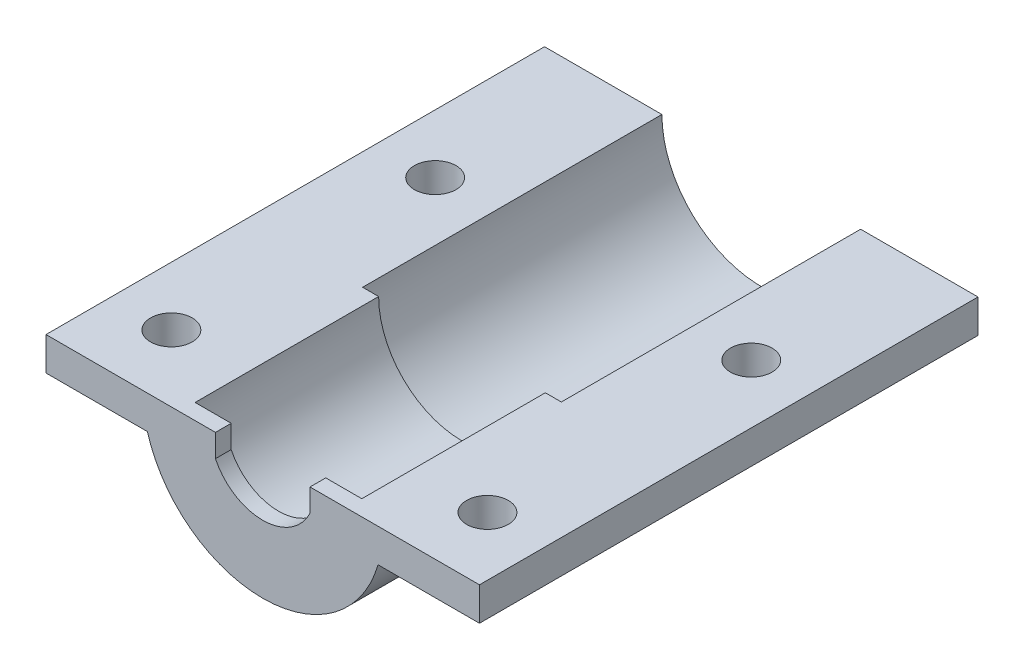
ISO-10303-21;
HEADER;
FILE_DESCRIPTION(('STEP AP214'),'2;1');
FILE_NAME('part.step','',(''),(''),'','','');
FILE_SCHEMA(('AUTOMOTIVE_DESIGN { 1 0 10303 214 1 1 1 1 }'));
ENDSEC;
DATA;
#1=APPLICATION_CONTEXT('core data for automotive mechanical design processes');
#2=APPLICATION_PROTOCOL_DEFINITION('international standard','automotive_design',2000,#1);
#3=PRODUCT_CONTEXT('',#1,'mechanical');
#4=PRODUCT('Part','Part','',(#3));
#5=PRODUCT_RELATED_PRODUCT_CATEGORY('part','',(#4));
#6=PRODUCT_DEFINITION_FORMATION('','',#4);
#7=PRODUCT_DEFINITION_CONTEXT('part definition',#1,'design');
#8=PRODUCT_DEFINITION('design','',#6,#7);
#9=PRODUCT_DEFINITION_SHAPE('','',#8);
#10=(LENGTH_UNIT() NAMED_UNIT(*) SI_UNIT(.MILLI.,.METRE.));
#11=(NAMED_UNIT(*) PLANE_ANGLE_UNIT() SI_UNIT($,.RADIAN.));
#12=(NAMED_UNIT(*) SI_UNIT($,.STERADIAN.) SOLID_ANGLE_UNIT());
#13=UNCERTAINTY_MEASURE_WITH_UNIT(LENGTH_MEASURE(1.E-05),#10,'distance_accuracy_value','');
#14=(GEOMETRIC_REPRESENTATION_CONTEXT(3) GLOBAL_UNCERTAINTY_ASSIGNED_CONTEXT((#13)) GLOBAL_UNIT_ASSIGNED_CONTEXT((#10,
#11,#12)) REPRESENTATION_CONTEXT('',''));
#15=CARTESIAN_POINT('',(0.,0.,0.));
#16=DIRECTION('',(0.,0.,1.));
#17=DIRECTION('',(1.,0.,0.));
#18=AXIS2_PLACEMENT_3D('',#15,#16,#17);
#19=CARTESIAN_POINT('',(0.,22.86,94.9452));
#20=DIRECTION('',(0.,0.,-1.));
#21=DIRECTION('',(-1.,0.,0.));
#22=AXIS2_PLACEMENT_3D('',#19,#20,#21);
#23=CYLINDRICAL_SURFACE('',#22,15.875);
#24=CARTESIAN_POINT('',(0.,22.86,91.948));
#25=DIRECTION('',(0.,0.,1.));
#26=DIRECTION('',(1.,0.,0.));
#27=AXIS2_PLACEMENT_3D('',#24,#25,#26);
#28=CIRCLE('',#27,15.875);
#29=CARTESIAN_POINT('',(-15.875,22.86,91.948));
#30=VERTEX_POINT('',#29);
#31=CARTESIAN_POINT('',(15.875,22.86,91.948));
#32=VERTEX_POINT('',#31);
#33=EDGE_CURVE('E258',#30,#32,#28,.T.);
#34=ORIENTED_EDGE('',*,*,#33,.T.);
#35=DIRECTION('',(0.,0.,-1.));
#36=VECTOR('',#35,1.);
#37=CARTESIAN_POINT('',(15.875,22.86,94.9452));
#38=LINE('',#37,#36);
#39=CARTESIAN_POINT('',(15.875,22.86,56.9976));
#40=VERTEX_POINT('',#39);
#41=EDGE_CURVE('E159',#32,#40,#38,.T.);
#42=ORIENTED_EDGE('',*,*,#41,.T.);
#43=CARTESIAN_POINT('',(0.,22.86,56.9976));
#44=DIRECTION('',(0.,0.,-1.));
#45=DIRECTION('',(-1.,0.,0.));
#46=AXIS2_PLACEMENT_3D('',#43,#44,#45);
#47=CIRCLE('',#46,15.875);
#48=CARTESIAN_POINT('',(-15.875,22.86,56.9976));
#49=VERTEX_POINT('',#48);
#50=EDGE_CURVE('E290',#49,#40,#47,.F.);
#51=ORIENTED_EDGE('',*,*,#50,.F.);
#52=DIRECTION('',(0.,0.,-1.));
#53=VECTOR('',#52,1.);
#54=CARTESIAN_POINT('',(-15.875,22.86,94.9452));
#55=LINE('',#54,#53);
#56=EDGE_CURVE('E130',#30,#49,#55,.T.);
#57=ORIENTED_EDGE('',*,*,#56,.F.);
#58=EDGE_LOOP('',(#34,#42,#51,#57));
#59=FACE_BOUND('',#58,.T.);
#60=ADVANCED_FACE('F36',(#59),#23,.F.);
#61=CARTESIAN_POINT('',(0.,22.86,94.9452));
#62=DIRECTION('',(0.,0.,-1.));
#63=DIRECTION('',(-1.,0.,0.));
#64=AXIS2_PLACEMENT_3D('',#61,#62,#63);
#65=CYLINDRICAL_SURFACE('',#64,22.86);
#66=CARTESIAN_POINT('',(0.,22.86,0.));
#67=DIRECTION('',(0.,0.,1.));
#68=DIRECTION('',(1.,0.,0.));
#69=AXIS2_PLACEMENT_3D('',#66,#67,#68);
#70=CIRCLE('',#69,22.86);
#71=CARTESIAN_POINT('',(-21.960352911554,16.51,0.));
#72=VERTEX_POINT('',#71);
#73=CARTESIAN_POINT('',(21.960352911554,16.51,0.));
#74=VERTEX_POINT('',#73);
#75=EDGE_CURVE('E139',#72,#74,#70,.T.);
#76=ORIENTED_EDGE('',*,*,#75,.T.);
#77=DIRECTION('',(0.,0.,-1.));
#78=VECTOR('',#77,1.);
#79=CARTESIAN_POINT('',(21.960352911554,16.51,94.9452));
#80=LINE('',#79,#78);
#81=CARTESIAN_POINT('',(21.960352911554,16.51,94.9452));
#82=VERTEX_POINT('',#81);
#83=EDGE_CURVE('E168',#82,#74,#80,.T.);
#84=ORIENTED_EDGE('',*,*,#83,.F.);
#85=CARTESIAN_POINT('',(0.,22.86,94.9452));
#86=DIRECTION('',(0.,0.,1.));
#87=DIRECTION('',(1.,0.,0.));
#88=AXIS2_PLACEMENT_3D('',#85,#86,#87);
#89=CIRCLE('',#88,22.86);
#90=CARTESIAN_POINT('',(-21.960352911554,16.51,94.9452));
#91=VERTEX_POINT('',#90);
#92=EDGE_CURVE('E154',#91,#82,#89,.T.);
#93=ORIENTED_EDGE('',*,*,#92,.F.);
#94=DIRECTION('',(0.,0.,-1.));
#95=VECTOR('',#94,1.);
#96=CARTESIAN_POINT('',(-21.960352911554,16.51,94.9452));
#97=LINE('',#96,#95);
#98=EDGE_CURVE('E135',#91,#72,#97,.T.);
#99=ORIENTED_EDGE('',*,*,#98,.T.);
#100=EDGE_LOOP('',(#76,#84,#93,#99));
#101=FACE_BOUND('',#100,.T.);
#102=ADVANCED_FACE('F38',(#101),#65,.T.);
#103=CARTESIAN_POINT('',(21.960352911554,16.51,94.9452));
#104=DIRECTION('',(0.,1.,0.));
#105=DIRECTION('',(-1.,0.,0.));
#106=AXIS2_PLACEMENT_3D('',#103,#104,#105);
#107=PLANE('',#106);
#108=CARTESIAN_POINT('',(30.099,16.51,32.004));
#109=DIRECTION('',(0.,-1.,0.));
#110=DIRECTION('',(0.,0.,-1.));
#111=AXIS2_PLACEMENT_3D('',#108,#109,#110);
#112=CIRCLE('',#111,3.96875000000001);
#113=CARTESIAN_POINT('',(30.099,16.51,28.03525));
#114=VERTEX_POINT('',#113);
#115=EDGE_CURVE('E225',#114,#114,#112,.T.);
#116=ORIENTED_EDGE('',*,*,#115,.F.);
#117=EDGE_LOOP('',(#116));
#118=FACE_BOUND('',#117,.T.);
#119=CARTESIAN_POINT('',(30.099,16.51,82.2452));
#120=DIRECTION('',(0.,-1.,0.));
#121=DIRECTION('',(0.,0.,-1.));
#122=AXIS2_PLACEMENT_3D('',#119,#120,#121);
#123=CIRCLE('',#122,3.96875000000001);
#124=CARTESIAN_POINT('',(30.099,16.51,78.27645));
#125=VERTEX_POINT('',#124);
#126=EDGE_CURVE('E228',#125,#125,#123,.T.);
#127=ORIENTED_EDGE('',*,*,#126,.F.);
#128=EDGE_LOOP('',(#127));
#129=FACE_BOUND('',#128,.T.);
#130=DIRECTION('',(1.,0.,0.));
#131=VECTOR('',#130,1.);
#132=CARTESIAN_POINT('',(21.960352911554,16.51,0.));
#133=LINE('',#132,#131);
#134=CARTESIAN_POINT('',(41.275,16.51,0.));
#135=VERTEX_POINT('',#134);
#136=EDGE_CURVE('E142',#74,#135,#133,.T.);
#137=ORIENTED_EDGE('',*,*,#136,.T.);
#138=DIRECTION('',(0.,0.,-1.));
#139=VECTOR('',#138,1.);
#140=CARTESIAN_POINT('',(41.275,16.51,94.9452));
#141=LINE('',#140,#139);
#142=CARTESIAN_POINT('',(41.275,16.51,94.9452));
#143=VERTEX_POINT('',#142);
#144=EDGE_CURVE('E165',#143,#135,#141,.T.);
#145=ORIENTED_EDGE('',*,*,#144,.F.);
#146=DIRECTION('',(1.,0.,0.));
#147=VECTOR('',#146,1.);
#148=CARTESIAN_POINT('',(21.960352911554,16.51,94.9452));
#149=LINE('',#148,#147);
#150=EDGE_CURVE('E96',#82,#143,#149,.T.);
#151=ORIENTED_EDGE('',*,*,#150,.F.);
#152=ORIENTED_EDGE('',*,*,#83,.T.);
#153=EDGE_LOOP('',(#137,#145,#151,#152));
#154=FACE_BOUND('',#153,.T.);
#155=ADVANCED_FACE('F189',(#118,#129,#154),#107,.F.);
#156=CARTESIAN_POINT('',(41.275,16.51,94.9452));
#157=DIRECTION('',(-1.,0.,0.));
#158=DIRECTION('',(0.,-1.,0.));
#159=AXIS2_PLACEMENT_3D('',#156,#157,#158);
#160=PLANE('',#159);
#161=DIRECTION('',(0.,1.,0.));
#162=VECTOR('',#161,1.);
#163=CARTESIAN_POINT('',(41.275,16.51,0.));
#164=LINE('',#163,#162);
#165=CARTESIAN_POINT('',(41.275,22.86,0.));
#166=VERTEX_POINT('',#165);
#167=EDGE_CURVE('E145',#135,#166,#164,.T.);
#168=ORIENTED_EDGE('',*,*,#167,.T.);
#169=DIRECTION('',(0.,0.,-1.));
#170=VECTOR('',#169,1.);
#171=CARTESIAN_POINT('',(41.275,22.86,94.9452));
#172=LINE('',#171,#170);
#173=CARTESIAN_POINT('',(41.275,22.86,94.9452));
#174=VERTEX_POINT('',#173);
#175=EDGE_CURVE('E162',#174,#166,#172,.T.);
#176=ORIENTED_EDGE('',*,*,#175,.F.);
#177=DIRECTION('',(0.,1.,0.));
#178=VECTOR('',#177,1.);
#179=CARTESIAN_POINT('',(41.275,16.51,94.9452));
#180=LINE('',#179,#178);
#181=EDGE_CURVE('E186',#143,#174,#180,.T.);
#182=ORIENTED_EDGE('',*,*,#181,.F.);
#183=ORIENTED_EDGE('',*,*,#144,.T.);
#184=EDGE_LOOP('',(#168,#176,#182,#183));
#185=FACE_BOUND('',#184,.T.);
#186=ADVANCED_FACE('F185',(#185),#160,.F.);
#187=CARTESIAN_POINT('',(41.275,22.86,94.9452));
#188=DIRECTION('',(0.,-1.,0.));
#189=DIRECTION('',(1.,0.,0.));
#190=AXIS2_PLACEMENT_3D('',#187,#188,#189);
#191=PLANE('',#190);
#192=CARTESIAN_POINT('',(30.099,22.86,32.004));
#193=DIRECTION('',(0.,-1.,0.));
#194=DIRECTION('',(0.,0.,-1.));
#195=AXIS2_PLACEMENT_3D('',#192,#193,#194);
#196=CIRCLE('',#195,3.96875000000001);
#197=CARTESIAN_POINT('',(30.099,22.86,28.03525));
#198=VERTEX_POINT('',#197);
#199=EDGE_CURVE('E231',#198,#198,#196,.T.);
#200=ORIENTED_EDGE('',*,*,#199,.T.);
#201=EDGE_LOOP('',(#200));
#202=FACE_BOUND('',#201,.T.);
#203=CARTESIAN_POINT('',(30.099,22.86,82.2452));
#204=DIRECTION('',(0.,-1.,0.));
#205=DIRECTION('',(0.,0.,-1.));
#206=AXIS2_PLACEMENT_3D('',#203,#204,#205);
#207=CIRCLE('',#206,3.96875000000001);
#208=CARTESIAN_POINT('',(30.099,22.86,78.27645));
#209=VERTEX_POINT('',#208);
#210=EDGE_CURVE('E230',#209,#209,#207,.T.);
#211=ORIENTED_EDGE('',*,*,#210,.T.);
#212=EDGE_LOOP('',(#211));
#213=FACE_BOUND('',#212,.T.);
#214=DIRECTION('',(-1.,0.,0.));
#215=VECTOR('',#214,1.);
#216=CARTESIAN_POINT('',(41.275,22.86,0.));
#217=LINE('',#216,#215);
#218=CARTESIAN_POINT('',(18.923,22.86,0.));
#219=VERTEX_POINT('',#218);
#220=EDGE_CURVE('E147',#166,#219,#217,.T.);
#221=ORIENTED_EDGE('',*,*,#220,.T.);
#222=DIRECTION('',(0.,0.,-1.));
#223=VECTOR('',#222,1.);
#224=CARTESIAN_POINT('',(18.923,22.86,56.9976));
#225=LINE('',#224,#223);
#226=CARTESIAN_POINT('',(18.923,22.86,56.9976));
#227=VERTEX_POINT('',#226);
#228=EDGE_CURVE('E51',#219,#227,#225,.F.);
#229=ORIENTED_EDGE('',*,*,#228,.T.);
#230=DIRECTION('',(1.,0.,0.));
#231=VECTOR('',#230,1.);
#232=CARTESIAN_POINT('',(41.275,22.86,56.9976));
#233=LINE('',#232,#231);
#234=EDGE_CURVE('E143',#40,#227,#233,.T.);
#235=ORIENTED_EDGE('',*,*,#234,.F.);
#236=ORIENTED_EDGE('',*,*,#41,.F.);
#237=DIRECTION('',(-1.,0.,0.));
#238=VECTOR('',#237,1.);
#239=CARTESIAN_POINT('',(9.0043,22.86,91.948));
#240=LINE('',#239,#238);
#241=CARTESIAN_POINT('',(9.0043,22.86,91.948));
#242=VERTEX_POINT('',#241);
#243=EDGE_CURVE('E260',#32,#242,#240,.T.);
#244=ORIENTED_EDGE('',*,*,#243,.T.);
#245=DIRECTION('',(0.,0.,1.));
#246=VECTOR('',#245,1.);
#247=CARTESIAN_POINT('',(9.0043,22.86,91.948));
#248=LINE('',#247,#246);
#249=CARTESIAN_POINT('',(9.0043,22.86,94.9452));
#250=VERTEX_POINT('',#249);
#251=EDGE_CURVE('E282',#242,#250,#248,.T.);
#252=ORIENTED_EDGE('',*,*,#251,.T.);
#253=DIRECTION('',(-1.,0.,0.));
#254=VECTOR('',#253,1.);
#255=CARTESIAN_POINT('',(41.275,22.86,94.9452));
#256=LINE('',#255,#254);
#257=EDGE_CURVE('E119',#174,#250,#256,.T.);
#258=ORIENTED_EDGE('',*,*,#257,.F.);
#259=ORIENTED_EDGE('',*,*,#175,.T.);
#260=EDGE_LOOP('',(#221,#229,#235,#236,#244,#252,#258,#259));
#261=FACE_BOUND('',#260,.T.);
#262=ADVANCED_FACE('F176',(#202,#213,#261),#191,.F.);
#263=CARTESIAN_POINT('',(-15.875,22.86,94.9452));
#264=DIRECTION('',(0.,-1.,0.));
#265=DIRECTION('',(1.,0.,0.));
#266=AXIS2_PLACEMENT_3D('',#263,#264,#265);
#267=PLANE('',#266);
#268=CARTESIAN_POINT('',(-30.099,22.86,32.004));
#269=DIRECTION('',(0.,-1.,0.));
#270=DIRECTION('',(0.,0.,-1.));
#271=AXIS2_PLACEMENT_3D('',#268,#269,#270);
#272=CIRCLE('',#271,3.96875000000001);
#273=CARTESIAN_POINT('',(-30.099,22.86,28.03525));
#274=VERTEX_POINT('',#273);
#275=EDGE_CURVE('E242',#274,#274,#272,.T.);
#276=ORIENTED_EDGE('',*,*,#275,.T.);
#277=EDGE_LOOP('',(#276));
#278=FACE_BOUND('',#277,.T.);
#279=CARTESIAN_POINT('',(-30.099,22.86,82.2452));
#280=DIRECTION('',(0.,-1.,0.));
#281=DIRECTION('',(0.,0.,-1.));
#282=AXIS2_PLACEMENT_3D('',#279,#280,#281);
#283=CIRCLE('',#282,3.96875000000001);
#284=CARTESIAN_POINT('',(-30.099,22.86,78.27645));
#285=VERTEX_POINT('',#284);
#286=EDGE_CURVE('E248',#285,#285,#283,.T.);
#287=ORIENTED_EDGE('',*,*,#286,.T.);
#288=EDGE_LOOP('',(#287));
#289=FACE_BOUND('',#288,.T.);
#290=DIRECTION('',(1.,0.,0.));
#291=VECTOR('',#290,1.);
#292=CARTESIAN_POINT('',(-15.875,22.86,56.9976));
#293=LINE('',#292,#291);
#294=CARTESIAN_POINT('',(-18.923,22.86,56.9976));
#295=VERTEX_POINT('',#294);
#296=EDGE_CURVE('E11',#295,#49,#293,.T.);
#297=ORIENTED_EDGE('',*,*,#296,.F.);
#298=DIRECTION('',(0.,0.,-1.));
#299=VECTOR('',#298,1.);
#300=CARTESIAN_POINT('',(-18.923,22.86,56.9976));
#301=LINE('',#300,#299);
#302=CARTESIAN_POINT('',(-18.923,22.86,0.));
#303=VERTEX_POINT('',#302);
#304=EDGE_CURVE('E287',#295,#303,#301,.T.);
#305=ORIENTED_EDGE('',*,*,#304,.T.);
#306=DIRECTION('',(-1.,0.,0.));
#307=VECTOR('',#306,1.);
#308=CARTESIAN_POINT('',(-15.875,22.86,0.));
#309=LINE('',#308,#307);
#310=CARTESIAN_POINT('',(-41.275,22.86,0.));
#311=VERTEX_POINT('',#310);
#312=EDGE_CURVE('E127',#303,#311,#309,.T.);
#313=ORIENTED_EDGE('',*,*,#312,.T.);
#314=DIRECTION('',(0.,0.,-1.));
#315=VECTOR('',#314,1.);
#316=CARTESIAN_POINT('',(-41.275,22.86,94.9452));
#317=LINE('',#316,#315);
#318=CARTESIAN_POINT('',(-41.275,22.86,94.9452));
#319=VERTEX_POINT('',#318);
#320=EDGE_CURVE('E122',#319,#311,#317,.T.);
#321=ORIENTED_EDGE('',*,*,#320,.F.);
#322=DIRECTION('',(-1.,0.,0.));
#323=VECTOR('',#322,1.);
#324=CARTESIAN_POINT('',(-15.875,22.86,94.9452));
#325=LINE('',#324,#323);
#326=CARTESIAN_POINT('',(-9.0043,22.86,94.9452));
#327=VERTEX_POINT('',#326);
#328=EDGE_CURVE('E106',#327,#319,#325,.T.);
#329=ORIENTED_EDGE('',*,*,#328,.F.);
#330=DIRECTION('',(0.,0.,1.));
#331=VECTOR('',#330,1.);
#332=CARTESIAN_POINT('',(-9.0043,22.86,91.948));
#333=LINE('',#332,#331);
#334=CARTESIAN_POINT('',(-9.0043,22.86,91.948));
#335=VERTEX_POINT('',#334);
#336=EDGE_CURVE('E269',#335,#327,#333,.T.);
#337=ORIENTED_EDGE('',*,*,#336,.F.);
#338=DIRECTION('',(-1.,0.,0.));
#339=VECTOR('',#338,1.);
#340=CARTESIAN_POINT('',(-15.875,22.86,91.948));
#341=LINE('',#340,#339);
#342=EDGE_CURVE('E254',#335,#30,#341,.T.);
#343=ORIENTED_EDGE('',*,*,#342,.T.);
#344=ORIENTED_EDGE('',*,*,#56,.T.);
#345=EDGE_LOOP('',(#297,#305,#313,#321,#329,#337,#343,#344));
#346=FACE_BOUND('',#345,.T.);
#347=ADVANCED_FACE('F124',(#278,#289,#346),#267,.F.);
#348=CARTESIAN_POINT('',(-41.275,16.51,94.9452));
#349=DIRECTION('',(1.,0.,0.));
#350=DIRECTION('',(0.,1.,0.));
#351=AXIS2_PLACEMENT_3D('',#348,#349,#350);
#352=PLANE('',#351);
#353=DIRECTION('',(0.,-1.,0.));
#354=VECTOR('',#353,1.);
#355=CARTESIAN_POINT('',(-41.275,16.51,0.));
#356=LINE('',#355,#354);
#357=CARTESIAN_POINT('',(-41.275,16.51,0.));
#358=VERTEX_POINT('',#357);
#359=EDGE_CURVE('E151',#311,#358,#356,.T.);
#360=ORIENTED_EDGE('',*,*,#359,.T.);
#361=DIRECTION('',(0.,0.,-1.));
#362=VECTOR('',#361,1.);
#363=CARTESIAN_POINT('',(-41.275,16.51,94.9452));
#364=LINE('',#363,#362);
#365=CARTESIAN_POINT('',(-41.275,16.51,94.9452));
#366=VERTEX_POINT('',#365);
#367=EDGE_CURVE('E131',#366,#358,#364,.T.);
#368=ORIENTED_EDGE('',*,*,#367,.F.);
#369=DIRECTION('',(0.,-1.,0.));
#370=VECTOR('',#369,1.);
#371=CARTESIAN_POINT('',(-41.275,16.51,94.9452));
#372=LINE('',#371,#370);
#373=EDGE_CURVE('E110',#319,#366,#372,.T.);
#374=ORIENTED_EDGE('',*,*,#373,.F.);
#375=ORIENTED_EDGE('',*,*,#320,.T.);
#376=EDGE_LOOP('',(#360,#368,#374,#375));
#377=FACE_BOUND('',#376,.T.);
#378=ADVANCED_FACE('F133',(#377),#352,.F.);
#379=CARTESIAN_POINT('',(-21.960352911554,16.51,94.9452));
#380=DIRECTION('',(0.,1.,0.));
#381=DIRECTION('',(-1.,0.,0.));
#382=AXIS2_PLACEMENT_3D('',#379,#380,#381);
#383=PLANE('',#382);
#384=CARTESIAN_POINT('',(-30.099,16.51,32.004));
#385=DIRECTION('',(0.,-1.,0.));
#386=DIRECTION('',(0.,0.,-1.));
#387=AXIS2_PLACEMENT_3D('',#384,#385,#386);
#388=CIRCLE('',#387,3.96875000000001);
#389=CARTESIAN_POINT('',(-30.099,16.51,28.03525));
#390=VERTEX_POINT('',#389);
#391=EDGE_CURVE('E234',#390,#390,#388,.T.);
#392=ORIENTED_EDGE('',*,*,#391,.F.);
#393=EDGE_LOOP('',(#392));
#394=FACE_BOUND('',#393,.T.);
#395=CARTESIAN_POINT('',(-30.099,16.51,82.2452));
#396=DIRECTION('',(0.,-1.,0.));
#397=DIRECTION('',(0.,0.,-1.));
#398=AXIS2_PLACEMENT_3D('',#395,#396,#397);
#399=CIRCLE('',#398,3.96875000000001);
#400=CARTESIAN_POINT('',(-30.099,16.51,78.27645));
#401=VERTEX_POINT('',#400);
#402=EDGE_CURVE('E245',#401,#401,#399,.T.);
#403=ORIENTED_EDGE('',*,*,#402,.F.);
#404=EDGE_LOOP('',(#403));
#405=FACE_BOUND('',#404,.T.);
#406=DIRECTION('',(1.,0.,0.));
#407=VECTOR('',#406,1.);
#408=CARTESIAN_POINT('',(-21.960352911554,16.51,0.));
#409=LINE('',#408,#407);
#410=EDGE_CURVE('E87',#358,#72,#409,.T.);
#411=ORIENTED_EDGE('',*,*,#410,.T.);
#412=ORIENTED_EDGE('',*,*,#98,.F.);
#413=DIRECTION('',(1.,0.,0.));
#414=VECTOR('',#413,1.);
#415=CARTESIAN_POINT('',(-21.960352911554,16.51,94.9452));
#416=LINE('',#415,#414);
#417=EDGE_CURVE('E60',#366,#91,#416,.T.);
#418=ORIENTED_EDGE('',*,*,#417,.F.);
#419=ORIENTED_EDGE('',*,*,#367,.T.);
#420=EDGE_LOOP('',(#411,#412,#418,#419));
#421=FACE_BOUND('',#420,.T.);
#422=ADVANCED_FACE('F192',(#394,#405,#421),#383,.F.);
#423=CARTESIAN_POINT('',(0.,22.86,94.9452));
#424=DIRECTION('',(0.,0.,1.));
#425=DIRECTION('',(1.,0.,0.));
#426=AXIS2_PLACEMENT_3D('',#423,#424,#425);
#427=PLANE('',#426);
#428=ORIENTED_EDGE('',*,*,#92,.T.);
#429=ORIENTED_EDGE('',*,*,#150,.T.);
#430=ORIENTED_EDGE('',*,*,#181,.T.);
#431=ORIENTED_EDGE('',*,*,#257,.T.);
#432=DIRECTION('',(0.,-1.,0.));
#433=VECTOR('',#432,1.);
#434=CARTESIAN_POINT('',(9.0043,22.86,94.9452));
#435=LINE('',#434,#433);
#436=CARTESIAN_POINT('',(9.0043,18.521727588083,94.9452));
#437=VERTEX_POINT('',#436);
#438=EDGE_CURVE('E271',#250,#437,#435,.T.);
#439=ORIENTED_EDGE('',*,*,#438,.T.);
#440=CARTESIAN_POINT('',(0.,22.86,94.9452));
#441=DIRECTION('',(0.,0.,-1.));
#442=DIRECTION('',(1.,0.,0.));
#443=AXIS2_PLACEMENT_3D('',#440,#441,#442);
#444=CIRCLE('',#443,9.9949);
#445=CARTESIAN_POINT('',(-9.0043,18.521727588083,94.9452));
#446=VERTEX_POINT('',#445);
#447=EDGE_CURVE('E255',#437,#446,#444,.T.);
#448=ORIENTED_EDGE('',*,*,#447,.T.);
#449=DIRECTION('',(0.,1.,0.));
#450=VECTOR('',#449,1.);
#451=CARTESIAN_POINT('',(-9.0043,22.86,94.9452));
#452=LINE('',#451,#450);
#453=EDGE_CURVE('E115',#446,#327,#452,.T.);
#454=ORIENTED_EDGE('',*,*,#453,.T.);
#455=ORIENTED_EDGE('',*,*,#328,.T.);
#456=ORIENTED_EDGE('',*,*,#373,.T.);
#457=ORIENTED_EDGE('',*,*,#417,.T.);
#458=EDGE_LOOP('',(#428,#429,#430,#431,#439,#448,#454,#455,#456,#457));
#459=FACE_BOUND('',#458,.T.);
#460=ADVANCED_FACE('F108',(#459),#427,.T.);
#461=CARTESIAN_POINT('',(0.,22.86,0.));
#462=DIRECTION('',(0.,0.,1.));
#463=DIRECTION('',(1.,0.,0.));
#464=AXIS2_PLACEMENT_3D('',#461,#462,#463);
#465=PLANE('',#464);
#466=ORIENTED_EDGE('',*,*,#312,.F.);
#467=CARTESIAN_POINT('',(0.,22.86,0.));
#468=DIRECTION('',(0.,0.,1.));
#469=DIRECTION('',(1.,0.,0.));
#470=AXIS2_PLACEMENT_3D('',#467,#468,#469);
#471=CIRCLE('',#470,18.923);
#472=EDGE_CURVE('E44',#303,#219,#471,.T.);
#473=ORIENTED_EDGE('',*,*,#472,.T.);
#474=ORIENTED_EDGE('',*,*,#220,.F.);
#475=ORIENTED_EDGE('',*,*,#167,.F.);
#476=ORIENTED_EDGE('',*,*,#136,.F.);
#477=ORIENTED_EDGE('',*,*,#75,.F.);
#478=ORIENTED_EDGE('',*,*,#410,.F.);
#479=ORIENTED_EDGE('',*,*,#359,.F.);
#480=EDGE_LOOP('',(#466,#473,#474,#475,#476,#477,#478,#479));
#481=FACE_BOUND('',#480,.T.);
#482=ADVANCED_FACE('F171',(#481),#465,.F.);
#483=CARTESIAN_POINT('',(0.,22.86,56.9976));
#484=DIRECTION('',(0.,0.,-1.));
#485=DIRECTION('',(-1.,0.,0.));
#486=AXIS2_PLACEMENT_3D('',#483,#484,#485);
#487=PLANE('',#486);
#488=ORIENTED_EDGE('',*,*,#234,.T.);
#489=CARTESIAN_POINT('',(0.,22.86,56.9976));
#490=DIRECTION('',(0.,0.,-1.));
#491=DIRECTION('',(-1.,0.,0.));
#492=AXIS2_PLACEMENT_3D('',#489,#490,#491);
#493=CIRCLE('',#492,18.923);
#494=EDGE_CURVE('E278',#227,#295,#493,.T.);
#495=ORIENTED_EDGE('',*,*,#494,.T.);
#496=ORIENTED_EDGE('',*,*,#296,.T.);
#497=ORIENTED_EDGE('',*,*,#50,.T.);
#498=EDGE_LOOP('',(#488,#495,#496,#497));
#499=FACE_BOUND('',#498,.T.);
#500=ADVANCED_FACE('F335',(#499),#487,.T.);
#501=CARTESIAN_POINT('',(0.,22.86,56.9976));
#502=DIRECTION('',(0.,0.,-1.));
#503=DIRECTION('',(-1.,0.,0.));
#504=AXIS2_PLACEMENT_3D('',#501,#502,#503);
#505=CYLINDRICAL_SURFACE('',#504,18.923);
#506=ORIENTED_EDGE('',*,*,#472,.F.);
#507=ORIENTED_EDGE('',*,*,#304,.F.);
#508=ORIENTED_EDGE('',*,*,#494,.F.);
#509=ORIENTED_EDGE('',*,*,#228,.F.);
#510=EDGE_LOOP('',(#506,#507,#508,#509));
#511=FACE_BOUND('',#510,.T.);
#512=ADVANCED_FACE('F336',(#511),#505,.F.);
#513=CARTESIAN_POINT('',(-9.0043,22.86,91.948));
#514=DIRECTION('',(1.,0.,0.));
#515=DIRECTION('',(0.,0.,-1.));
#516=AXIS2_PLACEMENT_3D('',#513,#514,#515);
#517=PLANE('',#516);
#518=ORIENTED_EDGE('',*,*,#453,.F.);
#519=DIRECTION('',(0.,0.,1.));
#520=VECTOR('',#519,1.);
#521=CARTESIAN_POINT('',(-9.0043,18.521727588083,91.948));
#522=LINE('',#521,#520);
#523=CARTESIAN_POINT('',(-9.0043,18.521727588083,91.948));
#524=VERTEX_POINT('',#523);
#525=EDGE_CURVE('E275',#524,#446,#522,.T.);
#526=ORIENTED_EDGE('',*,*,#525,.F.);
#527=DIRECTION('',(0.,1.,0.));
#528=VECTOR('',#527,1.);
#529=CARTESIAN_POINT('',(-9.0043,22.86,91.948));
#530=LINE('',#529,#528);
#531=EDGE_CURVE('E251',#524,#335,#530,.T.);
#532=ORIENTED_EDGE('',*,*,#531,.T.);
#533=ORIENTED_EDGE('',*,*,#336,.T.);
#534=EDGE_LOOP('',(#518,#526,#532,#533));
#535=FACE_BOUND('',#534,.T.);
#536=ADVANCED_FACE('F338',(#535),#517,.T.);
#537=CARTESIAN_POINT('',(0.,22.86,91.948));
#538=DIRECTION('',(0.,0.,1.));
#539=DIRECTION('',(1.,0.,0.));
#540=AXIS2_PLACEMENT_3D('',#537,#538,#539);
#541=CYLINDRICAL_SURFACE('',#540,9.9949);
#542=ORIENTED_EDGE('',*,*,#447,.F.);
#543=DIRECTION('',(0.,0.,1.));
#544=VECTOR('',#543,1.);
#545=CARTESIAN_POINT('',(9.0043,18.521727588083,91.948));
#546=LINE('',#545,#544);
#547=CARTESIAN_POINT('',(9.0043,18.521727588083,91.948));
#548=VERTEX_POINT('',#547);
#549=EDGE_CURVE('E279',#548,#437,#546,.T.);
#550=ORIENTED_EDGE('',*,*,#549,.F.);
#551=CARTESIAN_POINT('',(0.,22.86,91.948));
#552=DIRECTION('',(0.,0.,-1.));
#553=DIRECTION('',(1.,0.,0.));
#554=AXIS2_PLACEMENT_3D('',#551,#552,#553);
#555=CIRCLE('',#554,9.9949);
#556=EDGE_CURVE('E266',#548,#524,#555,.T.);
#557=ORIENTED_EDGE('',*,*,#556,.T.);
#558=ORIENTED_EDGE('',*,*,#525,.T.);
#559=EDGE_LOOP('',(#542,#550,#557,#558));
#560=FACE_BOUND('',#559,.T.);
#561=ADVANCED_FACE('F315',(#560),#541,.F.);
#562=CARTESIAN_POINT('',(9.0043,22.86,91.948));
#563=DIRECTION('',(-1.,0.,0.));
#564=DIRECTION('',(0.,0.,1.));
#565=AXIS2_PLACEMENT_3D('',#562,#563,#564);
#566=PLANE('',#565);
#567=ORIENTED_EDGE('',*,*,#438,.F.);
#568=ORIENTED_EDGE('',*,*,#251,.F.);
#569=DIRECTION('',(0.,-1.,0.));
#570=VECTOR('',#569,1.);
#571=CARTESIAN_POINT('',(9.0043,22.86,91.948));
#572=LINE('',#571,#570);
#573=EDGE_CURVE('E263',#242,#548,#572,.T.);
#574=ORIENTED_EDGE('',*,*,#573,.T.);
#575=ORIENTED_EDGE('',*,*,#549,.T.);
#576=EDGE_LOOP('',(#567,#568,#574,#575));
#577=FACE_BOUND('',#576,.T.);
#578=ADVANCED_FACE('F308',(#577),#566,.T.);
#579=CARTESIAN_POINT('',(0.,22.86,91.948));
#580=DIRECTION('',(0.,0.,1.));
#581=DIRECTION('',(1.,0.,0.));
#582=AXIS2_PLACEMENT_3D('',#579,#580,#581);
#583=PLANE('',#582);
#584=ORIENTED_EDGE('',*,*,#531,.F.);
#585=ORIENTED_EDGE('',*,*,#556,.F.);
#586=ORIENTED_EDGE('',*,*,#573,.F.);
#587=ORIENTED_EDGE('',*,*,#243,.F.);
#588=ORIENTED_EDGE('',*,*,#33,.F.);
#589=ORIENTED_EDGE('',*,*,#342,.F.);
#590=EDGE_LOOP('',(#584,#585,#586,#587,#588,#589));
#591=FACE_BOUND('',#590,.T.);
#592=ADVANCED_FACE('F395',(#591),#583,.F.);
#593=CARTESIAN_POINT('',(-30.099,16.51,82.2452));
#594=DIRECTION('',(0.,-1.,0.));
#595=DIRECTION('',(0.,0.,-1.));
#596=AXIS2_PLACEMENT_3D('',#593,#594,#595);
#597=CYLINDRICAL_SURFACE('',#596,3.96875000000001);
#598=ORIENTED_EDGE('',*,*,#286,.F.);
#599=EDGE_LOOP('',(#598));
#600=FACE_BOUND('',#599,.T.);
#601=ORIENTED_EDGE('',*,*,#402,.T.);
#602=EDGE_LOOP('',(#601));
#603=FACE_BOUND('',#602,.T.);
#604=ADVANCED_FACE('F404',(#600,#603),#597,.F.);
#605=CARTESIAN_POINT('',(-30.099,16.51,32.004));
#606=DIRECTION('',(0.,-1.,0.));
#607=DIRECTION('',(0.,0.,-1.));
#608=AXIS2_PLACEMENT_3D('',#605,#606,#607);
#609=CYLINDRICAL_SURFACE('',#608,3.96875000000001);
#610=ORIENTED_EDGE('',*,*,#275,.F.);
#611=EDGE_LOOP('',(#610));
#612=FACE_BOUND('',#611,.T.);
#613=ORIENTED_EDGE('',*,*,#391,.T.);
#614=EDGE_LOOP('',(#613));
#615=FACE_BOUND('',#614,.T.);
#616=ADVANCED_FACE('F427',(#612,#615),#609,.F.);
#617=CARTESIAN_POINT('',(30.099,16.51,82.2452));
#618=DIRECTION('',(0.,-1.,0.));
#619=DIRECTION('',(0.,0.,-1.));
#620=AXIS2_PLACEMENT_3D('',#617,#618,#619);
#621=CYLINDRICAL_SURFACE('',#620,3.96875000000001);
#622=ORIENTED_EDGE('',*,*,#210,.F.);
#623=EDGE_LOOP('',(#622));
#624=FACE_BOUND('',#623,.T.);
#625=ORIENTED_EDGE('',*,*,#126,.T.);
#626=EDGE_LOOP('',(#625));
#627=FACE_BOUND('',#626,.T.);
#628=ADVANCED_FACE('F436',(#624,#627),#621,.F.);
#629=CARTESIAN_POINT('',(30.099,16.51,32.004));
#630=DIRECTION('',(0.,-1.,0.));
#631=DIRECTION('',(0.,0.,-1.));
#632=AXIS2_PLACEMENT_3D('',#629,#630,#631);
#633=CYLINDRICAL_SURFACE('',#632,3.96875000000001);
#634=ORIENTED_EDGE('',*,*,#199,.F.);
#635=EDGE_LOOP('',(#634));
#636=FACE_BOUND('',#635,.T.);
#637=ORIENTED_EDGE('',*,*,#115,.T.);
#638=EDGE_LOOP('',(#637));
#639=FACE_BOUND('',#638,.T.);
#640=ADVANCED_FACE('F459',(#636,#639),#633,.F.);
#641=CLOSED_SHELL('',(#60,#102,#155,#186,#262,#347,#378,#422,#460,#482,#500,#512,#536,#561,#578,
#592,#604,#616,#628,#640));
#642=MANIFOLD_SOLID_BREP('B2',#641);
#643=ADVANCED_BREP_SHAPE_REPRESENTATION('',(#18,#642),#14);
#644=SHAPE_DEFINITION_REPRESENTATION(#9,#643);
ENDSEC;
END-ISO-10303-21;
